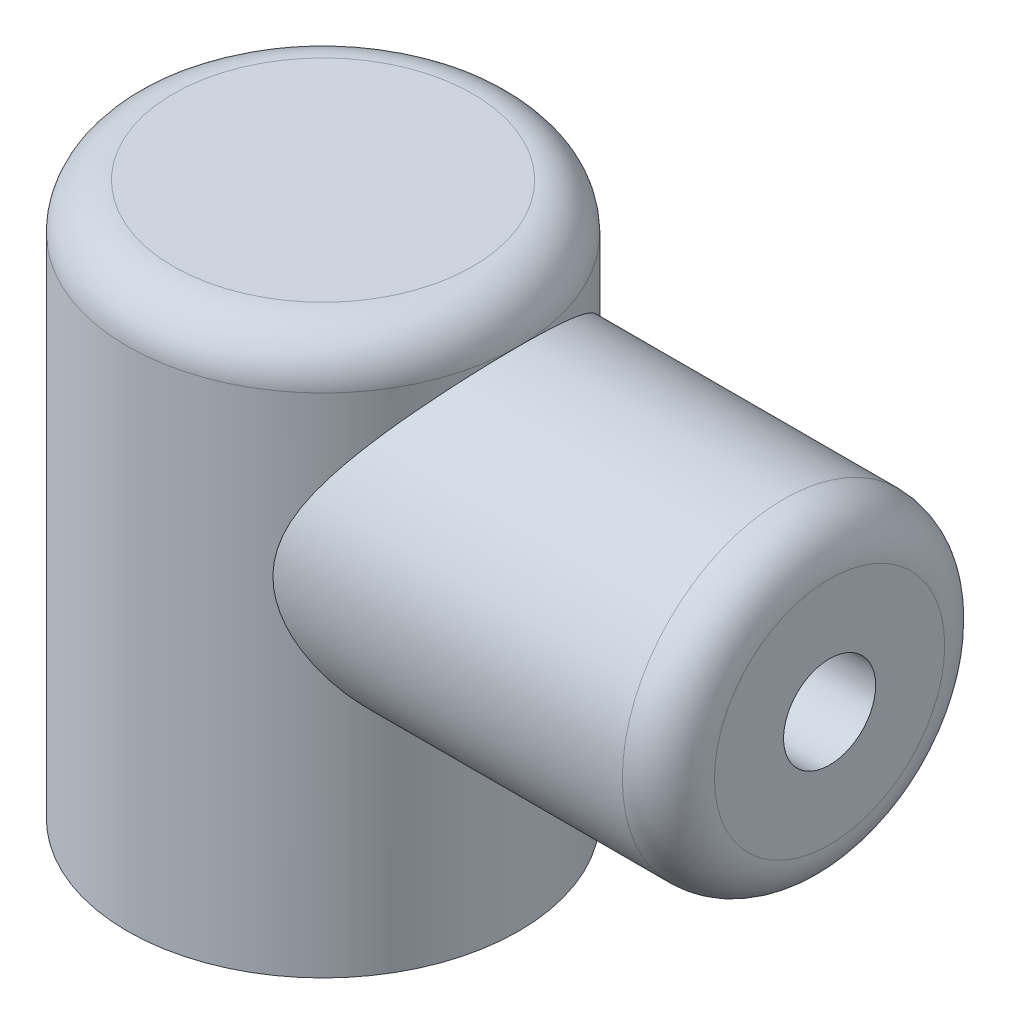
ISO-10303-21;
HEADER;
FILE_DESCRIPTION(('STEP AP214'),'2;1');
FILE_NAME('part.step','',(''),(''),'','','');
FILE_SCHEMA(('AUTOMOTIVE_DESIGN { 1 0 10303 214 1 1 1 1 }'));
ENDSEC;
DATA;
#1=APPLICATION_CONTEXT('core data for automotive mechanical design processes');
#2=APPLICATION_PROTOCOL_DEFINITION('international standard','automotive_design',2000,#1);
#3=PRODUCT_CONTEXT('',#1,'mechanical');
#4=PRODUCT('Part','Part','',(#3));
#5=PRODUCT_RELATED_PRODUCT_CATEGORY('part','',(#4));
#6=PRODUCT_DEFINITION_FORMATION('','',#4);
#7=PRODUCT_DEFINITION_CONTEXT('part definition',#1,'design');
#8=PRODUCT_DEFINITION('design','',#6,#7);
#9=PRODUCT_DEFINITION_SHAPE('','',#8);
#10=(LENGTH_UNIT() NAMED_UNIT(*) SI_UNIT(.MILLI.,.METRE.));
#11=(NAMED_UNIT(*) PLANE_ANGLE_UNIT() SI_UNIT($,.RADIAN.));
#12=(NAMED_UNIT(*) SI_UNIT($,.STERADIAN.) SOLID_ANGLE_UNIT());
#13=UNCERTAINTY_MEASURE_WITH_UNIT(LENGTH_MEASURE(1.E-05),#10,'distance_accuracy_value','');
#14=(GEOMETRIC_REPRESENTATION_CONTEXT(3) GLOBAL_UNCERTAINTY_ASSIGNED_CONTEXT((#13)) GLOBAL_UNIT_ASSIGNED_CONTEXT((#10,
#11,#12)) REPRESENTATION_CONTEXT('',''));
#15=CARTESIAN_POINT('',(0.,0.,0.));
#16=DIRECTION('',(0.,0.,1.));
#17=DIRECTION('',(1.,0.,0.));
#18=AXIS2_PLACEMENT_3D('',#15,#16,#17);
#19=CARTESIAN_POINT('',(0.,120.,0.));
#20=DIRECTION('',(0.,-1.,0.));
#21=DIRECTION('',(0.,0.,-1.));
#22=AXIS2_PLACEMENT_3D('',#19,#20,#21);
#23=CYLINDRICAL_SURFACE('',#22,42.5);
#24=CARTESIAN_POINT('',(0.,0.,0.));
#25=DIRECTION('',(0.,1.,0.));
#26=DIRECTION('',(0.,0.,1.));
#27=AXIS2_PLACEMENT_3D('',#24,#25,#26);
#28=CIRCLE('',#27,42.5);
#29=CARTESIAN_POINT('',(0.,0.,42.5));
#30=VERTEX_POINT('',#29);
#31=EDGE_CURVE('E75',#30,#30,#28,.T.);
#32=ORIENTED_EDGE('',*,*,#31,.T.);
#33=EDGE_LOOP('',(#32));
#34=FACE_BOUND('',#33,.T.);
#35=CARTESIAN_POINT('',(24.1091269024824,75.,35.));
#36=CARTESIAN_POINT('',(24.1091441163489,74.3695805554471,34.9999933033889));
#37=CARTESIAN_POINT('',(24.1339807896554,73.7389896330274,34.9829201330865));
#38=CARTESIAN_POINT('',(24.2320409000779,72.4831730395529,34.9150622819182));
#39=CARTESIAN_POINT('',(24.3052945978711,71.8579509717511,34.8642565180653));
#40=CARTESIAN_POINT('',(24.4967277254122,70.6162675829255,34.7300149179889));
#41=CARTESIAN_POINT('',(24.6150307906742,69.999835258718,34.6464892655435));
#42=CARTESIAN_POINT('',(24.8912020466167,68.7811144364059,34.4486112138779));
#43=CARTESIAN_POINT('',(25.0490705935653,68.1788260657144,34.3342585370747));
#44=CARTESIAN_POINT('',(25.4640931589299,66.767093372393,34.0282080527054));
#45=CARTESIAN_POINT('',(25.7362634759287,65.9648596080729,33.8235935171676));
#46=CARTESIAN_POINT('',(26.3290738615771,64.3933646844921,33.3642078147038));
#47=CARTESIAN_POINT('',(26.649737816113,63.6241200152503,33.109411911787));
#48=CARTESIAN_POINT('',(27.3270848190682,62.1169149523671,32.552621407464));
#49=CARTESIAN_POINT('',(27.6838577091993,61.3790394156592,32.2505080018764));
#50=CARTESIAN_POINT('',(28.4217651117175,59.9357568725332,31.6021277153579));
#51=CARTESIAN_POINT('',(28.8028986750918,59.2303486031348,31.255862553914));
#52=CARTESIAN_POINT('',(29.4675587242691,58.0515534667091,30.6277200083681));
#53=CARTESIAN_POINT('',(29.7472547292273,57.5703246689317,30.3563829941905));
#54=CARTESIAN_POINT('',(30.3118014178767,56.6233878205289,29.7926799637585));
#55=CARTESIAN_POINT('',(30.596652484685,56.1576809308398,29.5003123796981));
#56=CARTESIAN_POINT('',(31.1691856471983,55.241557934973,28.8947322720906));
#57=CARTESIAN_POINT('',(31.4568685910821,54.7911466015689,28.5815133307896));
#58=CARTESIAN_POINT('',(32.0328526611075,53.9057699221076,27.9344604761189));
#59=CARTESIAN_POINT('',(32.3211538419368,53.4708060077595,27.6006246597338));
#60=CARTESIAN_POINT('',(33.1834350411128,52.1901411859788,26.5690023825928));
#61=CARTESIAN_POINT('',(33.755464342043,51.3676070045341,25.8404000996342));
#62=CARTESIAN_POINT('',(34.879502584609,49.7881642111188,24.3018108099273));
#63=CARTESIAN_POINT('',(35.4315187730531,49.0312317036969,23.4918536708029));
#64=CARTESIAN_POINT('',(36.3910411335628,47.7382278759611,21.9676161326934));
#65=CARTESIAN_POINT('',(36.8047419369442,47.1889444051907,21.2684231386584));
#66=CARTESIAN_POINT('',(37.6046887429783,46.1386339586623,19.8197336210164));
#67=CARTESIAN_POINT('',(37.9909358657603,45.6376050137896,19.0702391521732));
#68=CARTESIAN_POINT('',(38.7287366943713,44.6890495290468,17.5233647077875));
#69=CARTESIAN_POINT('',(39.0803347747587,44.2414543976431,16.7260481404061));
#70=CARTESIAN_POINT('',(39.7425395451134,43.4043515489623,15.085183902923));
#71=CARTESIAN_POINT('',(40.0531534793446,43.0148335645149,14.2416444404813));
#72=CARTESIAN_POINT('',(40.5779874405307,42.3602313940538,12.6589666481398));
#73=CARTESIAN_POINT('',(40.7996220335838,42.0852467866725,11.9263711998335));
#74=CARTESIAN_POINT('',(41.2062283008463,41.5825627695573,10.4352144098018));
#75=CARTESIAN_POINT('',(41.391203808074,41.354858416153,9.67665579248249));
#76=CARTESIAN_POINT('',(41.7210157408059,40.9499346756677,8.13791582165729));
#77=CARTESIAN_POINT('',(41.86586776934,40.7726956631113,7.35774300357778));
#78=CARTESIAN_POINT('',(42.1126270597445,40.471303916865,5.78046106855623));
#79=CARTESIAN_POINT('',(42.2145338219223,40.347151800871,4.98335175466177));
#80=CARTESIAN_POINT('',(42.3735384783194,40.153625357556,3.37476014399933));
#81=CARTESIAN_POINT('',(42.4304544482362,40.0844734215185,2.56323292400519));
#82=CARTESIAN_POINT('',(42.4975130508196,40.0030122228911,0.935386300685297));
#83=CARTESIAN_POINT('',(42.5076555876615,39.990703076755,0.119066887545232));
#84=CARTESIAN_POINT('',(42.4809362227141,40.0231501661696,-1.51164080281081));
#85=CARTESIAN_POINT('',(42.4440751490446,40.0679053963479,-2.32602911379611));
#86=CARTESIAN_POINT('',(42.3241859576354,40.2136745767323,-3.94628377312993));
#87=CARTESIAN_POINT('',(42.2411592625876,40.3146867932599,-4.75215038331295));
#88=CARTESIAN_POINT('',(42.0374583698247,40.5630634196291,-6.29851445820613));
#89=CARTESIAN_POINT('',(41.9195072796505,40.7070799748745,-7.03991516587761));
#90=CARTESIAN_POINT('',(41.6468952197124,41.040860520042,-8.5053855168105));
#91=CARTESIAN_POINT('',(41.4922361415418,41.23062215269,-9.22945605099443));
#92=CARTESIAN_POINT('',(41.1488213673743,41.6534752146308,-10.6566097709098));
#93=CARTESIAN_POINT('',(40.9600606704953,41.8865729991636,-11.359689860822));
#94=CARTESIAN_POINT('',(40.5514237117821,42.3933989560956,-12.7417190982193));
#95=CARTESIAN_POINT('',(40.3315456126257,42.6671295276978,-13.4206668178486));
#96=CARTESIAN_POINT('',(39.8429850772002,43.2785527289007,-14.8113819440679));
#97=CARTESIAN_POINT('',(39.5716996663059,43.6197714069671,-15.5206828270397));
#98=CARTESIAN_POINT('',(39.0001563640812,44.3436542190332,-16.9055941709998));
#99=CARTESIAN_POINT('',(38.6998970687751,44.7263203615457,-17.5812029969775));
#100=CARTESIAN_POINT('',(38.0745191516996,45.5299687888279,-18.8974073668099));
#101=CARTESIAN_POINT('',(37.7493941542164,45.9509609059072,-19.53799385804));
#102=CARTESIAN_POINT('',(37.0784915178842,46.8283044417351,-20.7830617562839));
#103=CARTESIAN_POINT('',(36.7327128658368,47.2846575955036,-21.3875413891034));
#104=CARTESIAN_POINT('',(35.9510630614449,48.3284360161716,-22.6815959809241));
#105=CARTESIAN_POINT('',(35.511387238714,48.9234081533923,-23.3627966550403));
#106=CARTESIAN_POINT('',(34.6149812757496,50.1579551695389,-24.6714873410868));
#107=CARTESIAN_POINT('',(34.1582485522642,50.7975368173653,-25.2989691695803));
#108=CARTESIAN_POINT('',(33.2344387856638,52.1198304233704,-26.5008927440641));
#109=CARTESIAN_POINT('',(32.7673477912127,52.8026031748346,-27.0752567954144));
#110=CARTESIAN_POINT('',(31.8313786645481,54.2090791139573,-28.1696935653511));
#111=CARTESIAN_POINT('',(31.3625006771722,54.9327790475617,-28.6897705908808));
#112=CARTESIAN_POINT('',(30.4411061286621,56.4060525611078,-29.6653009371319));
#113=CARTESIAN_POINT('',(29.9884498109046,57.1548210153051,-30.1218372394161));
#114=CARTESIAN_POINT('',(29.0997407595218,58.6923714170278,-30.9812374405547));
#115=CARTESIAN_POINT('',(28.6636914723462,59.4811615918803,-31.3840902413788));
#116=CARTESIAN_POINT('',(27.8212819214794,61.0985695481815,-32.1332127703566));
#117=CARTESIAN_POINT('',(27.4148727165001,61.9271177496787,-32.4795769972687));
#118=CARTESIAN_POINT('',(26.6464876050765,63.6263961944204,-33.1128716569087));
#119=CARTESIAN_POINT('',(26.2844849999021,64.4971006483221,-33.3998378737553));
#120=CARTESIAN_POINT('',(25.7445721698184,65.9551475912818,-33.8162312800062));
#121=CARTESIAN_POINT('',(25.5476786130233,66.529994128178,-33.9649404187285));
#122=CARTESIAN_POINT('',(25.1851728254214,67.695906369798,-34.2346034575806));
#123=CARTESIAN_POINT('',(25.0195565007119,68.2869699402458,-34.355560990587));
#124=CARTESIAN_POINT('',(24.7257109661857,69.4822640170546,-34.5676452918854));
#125=CARTESIAN_POINT('',(24.5974004052514,70.0864627379659,-34.6588370233398));
#126=CARTESIAN_POINT('',(24.3830566419295,71.3062628694528,-34.8099676845401));
#127=CARTESIAN_POINT('',(24.2970222205602,71.921863950724,-34.8699075153999));
#128=CARTESIAN_POINT('',(24.1708242762511,73.1656855332413,-34.9575072897095));
#129=CARTESIAN_POINT('',(24.1310764462856,73.7939696074419,-34.9848747531072));
#130=CARTESIAN_POINT('',(24.1009788606688,75.0522716929145,-35.0056163215024));
#131=CARTESIAN_POINT('',(24.1106270125899,75.6822896296098,-34.9989918664071));
#132=CARTESIAN_POINT('',(24.1788208945623,76.9389275773781,-34.9519139228089));
#133=CARTESIAN_POINT('',(24.2374103556555,77.5655440449216,-34.9114301796205));
#134=CARTESIAN_POINT('',(24.4004776174839,78.8097321316398,-34.7976499588347));
#135=CARTESIAN_POINT('',(24.5049625164107,79.4273023364457,-34.7243484055988));
#136=CARTESIAN_POINT('',(24.7787000188258,80.7654536295011,-34.5296871646768));
#137=CARTESIAN_POINT('',(24.9564813786516,81.4833397822663,-34.4018468109058));
#138=CARTESIAN_POINT('',(25.3603432613096,82.8966060528211,-34.105212373137));
#139=CARTESIAN_POINT('',(25.5864365168466,83.5919801817769,-33.9364074912548));
#140=CARTESIAN_POINT('',(26.0776826426794,84.960141321715,-33.560398298354));
#141=CARTESIAN_POINT('',(26.3429382589091,85.6328630202011,-33.3530925963355));
#142=CARTESIAN_POINT('',(26.9031276295858,86.9534942026062,-32.9028993396459));
#143=CARTESIAN_POINT('',(27.1980632176493,87.6014021501237,-32.6600095861835));
#144=CARTESIAN_POINT('',(27.7414828569742,88.730505568017,-32.1987158271231));
#145=CARTESIAN_POINT('',(27.9855993288178,89.2165726243723,-31.9869886908371));
#146=CARTESIAN_POINT('',(28.4840946806354,90.174350149901,-31.5438987457715));
#147=CARTESIAN_POINT('',(28.7384747035184,90.6460590098837,-31.3125337470125));
#148=CARTESIAN_POINT('',(29.2549053792374,91.5755507181167,-30.8305903021718));
#149=CARTESIAN_POINT('',(29.5169592824851,92.0333274927409,-30.5800036394458));
#150=CARTESIAN_POINT('',(30.046278028044,92.9349329575586,-30.0600883878982));
#151=CARTESIAN_POINT('',(30.3135427010669,93.3787620996654,-29.7907604072193));
#152=CARTESIAN_POINT('',(31.120663519617,94.6906771606373,-28.9543508205841));
#153=CARTESIAN_POINT('',(31.6653116448631,95.5382446701609,-28.3593355375047));
#154=CARTESIAN_POINT('',(32.7526412519324,97.1779426085027,-27.0962984822016));
#155=CARTESIAN_POINT('',(33.2953230810556,97.9700833301383,-26.4282903241745));
#156=CARTESIAN_POINT('',(34.3829006560159,99.5203602795836,-24.9979555277008));
#157=CARTESIAN_POINT('',(34.9273622210808,100.276730815455,-24.2333790254022));
#158=CARTESIAN_POINT('',(35.9889816373986,101.724498266931,-22.6267551371842));
#159=CARTESIAN_POINT('',(36.5061348587855,102.41588418042,-21.7846946805565));
#160=CARTESIAN_POINT('',(37.2512410271021,103.398064112907,-20.4658133699474));
#161=CARTESIAN_POINT('',(37.4942540792765,103.715986440819,-20.0174140874554));
#162=CARTESIAN_POINT('',(37.9688331375198,104.332937169202,-19.1019221508278));
#163=CARTESIAN_POINT('',(38.2003998495445,104.631966735207,-18.6348306527628));
#164=CARTESIAN_POINT('',(38.6503934657029,105.209861723029,-17.6825972147274));
#165=CARTESIAN_POINT('',(38.8688275210651,105.488738136022,-17.1974653357027));
#166=CARTESIAN_POINT('',(39.2911658271326,106.025362362867,-16.2093519303902));
#167=CARTESIAN_POINT('',(39.4950666651489,106.283105216261,-15.7063662529405));
#168=CARTESIAN_POINT('',(39.961770855315,106.870614812976,-14.4872567515579));
#169=CARTESIAN_POINT('',(40.2172099898158,107.190140784834,-13.7633080306653));
#170=CARTESIAN_POINT('',(40.6929503627197,107.782576937913,-12.2856065680239));
#171=CARTESIAN_POINT('',(40.9132607764861,108.055499292981,-11.5318616732146));
#172=CARTESIAN_POINT('',(41.3147950049561,108.551205757138,-9.99827633863648));
#173=CARTESIAN_POINT('',(41.4960383253829,108.774014889574,-9.2184491471666));
#174=CARTESIAN_POINT('',(41.8160125289117,109.166384119767,-7.63688183296249));
#175=CARTESIAN_POINT('',(41.9547422135317,109.335942716367,-6.83514109316752));
#176=CARTESIAN_POINT('',(42.187361355377,109.619793762307,-5.21087176073392));
#177=CARTESIAN_POINT('',(42.2810023992382,109.733780081405,-4.38825371048778));
#178=CARTESIAN_POINT('',(42.4201707448668,109.903054510551,-2.7329307424936));
#179=CARTESIAN_POINT('',(42.4656981595955,109.95834275841,-1.90022584843212));
#180=CARTESIAN_POINT('',(42.5075576969748,110.009179784858,-0.231859798571524));
#181=CARTESIAN_POINT('',(42.5038960583348,110.004736139317,0.60380096888996));
#182=CARTESIAN_POINT('',(42.4474764902901,109.936208220153,2.27096895465849));
#183=CARTESIAN_POINT('',(42.3947211544893,109.872127097158,3.10247639005167));
#184=CARTESIAN_POINT('',(42.2477514791521,109.693296785335,4.68575327694705));
#185=CARTESIAN_POINT('',(42.1573431167778,109.583196269004,5.43841104448095));
#186=CARTESIAN_POINT('',(41.9380524744517,109.315537824192,6.92946833560324));
#187=CARTESIAN_POINT('',(41.8091727766414,109.157983080766,7.66786881258052));
#188=CARTESIAN_POINT('',(41.5152557823321,108.797593546155,9.12616600337175));
#189=CARTESIAN_POINT('',(41.3502168929955,108.594756760257,9.84606190048466));
#190=CARTESIAN_POINT('',(40.9867476909895,108.146353036506,11.2637524783362));
#191=CARTESIAN_POINT('',(40.7883154163228,107.900783587908,11.9615458575978));
#192=CARTESIAN_POINT('',(40.3482857025656,107.35370386355,13.3732882061727));
#193=CARTESIAN_POINT('',(40.1048118896067,107.049720066226,14.0856915882014));
#194=CARTESIAN_POINT('',(39.5876117835045,106.400121469394,15.4797884367949));
#195=CARTESIAN_POINT('',(39.3138850936957,106.054506124022,16.1614815005311));
#196=CARTESIAN_POINT('',(38.7399424761209,105.324643415158,17.4926416055811));
#197=CARTESIAN_POINT('',(38.439714099846,104.940377884757,18.1420932761085));
#198=CARTESIAN_POINT('',(37.8166848831181,104.136168949526,19.4073623014548));
#199=CARTESIAN_POINT('',(37.4938796121909,103.716218538425,20.0231730121267));
#200=CARTESIAN_POINT('',(36.9184804761093,102.960100030678,21.0600859288104));
#201=CARTESIAN_POINT('',(36.6702058416058,102.631573055538,21.4892048632024));
#202=CARTESIAN_POINT('',(36.1651752550817,101.957736699448,22.3286825857205));
#203=CARTESIAN_POINT('',(35.9084207462345,101.612430169511,22.7390445380097));
#204=CARTESIAN_POINT('',(35.1273353063363,100.552083951423,23.9423189358798));
#205=CARTESIAN_POINT('',(34.5923105148656,99.8127847145118,24.7071917857433));
#206=CARTESIAN_POINT('',(33.5050024348188,98.2730139488999,26.1627991096799));
#207=CARTESIAN_POINT('',(32.9526861900428,97.4724208001887,26.8533792843033));
#208=CARTESIAN_POINT('',(31.8447254119797,95.8138882330314,28.1583962770441));
#209=CARTESIAN_POINT('',(31.2890818197064,94.9559643900877,28.7728536476472));
#210=CARTESIAN_POINT('',(30.2883763604854,93.3428506991626,29.820977967668));
#211=CARTESIAN_POINT('',(29.841428487091,92.5970019783134,30.267271600765));
#212=CARTESIAN_POINT('',(28.9649937630786,91.0659642866541,31.1070284140741));
#213=CARTESIAN_POINT('',(28.5355092150414,90.280770158332,31.500484643197));
#214=CARTESIAN_POINT('',(27.7071842885278,88.6716144396135,32.2314494959254));
#215=CARTESIAN_POINT('',(27.3082785906982,87.8477419099065,32.5690792638946));
#216=CARTESIAN_POINT('',(26.5554801267719,86.1586010830552,33.1857342257335));
#217=CARTESIAN_POINT('',(26.201560288575,85.2933581179007,33.4647947325602));
#218=CARTESIAN_POINT('',(25.6688552554142,83.8278782052265,33.8737477477291));
#219=CARTESIAN_POINT('',(25.4718028359175,83.239338588151,34.0218698646593));
#220=CARTESIAN_POINT('',(25.1110530375758,82.0454678647285,34.2889981703046));
#221=CARTESIAN_POINT('',(24.9473564890271,81.4401363408222,34.408003634261));
#222=CARTESIAN_POINT('',(24.6599486703108,80.2168242323189,34.6145671266489));
#223=CARTESIAN_POINT('',(24.5361092004101,79.598891141023,34.7022260838274));
#224=CARTESIAN_POINT('',(24.3333050845834,78.3521876248991,34.8447389624851));
#225=CARTESIAN_POINT('',(24.2543103895072,77.7234247485492,34.8996148522165));
#226=CARTESIAN_POINT('',(24.1696634090026,76.7443416969682,34.9582401394468));
#227=CARTESIAN_POINT('',(24.147003011616,76.3961052237049,34.973884441717));
#228=CARTESIAN_POINT('',(24.1167284723043,75.6985968470358,34.994767276351));
#229=CARTESIAN_POINT('',(24.109117364024,75.3493247490761,35.0000037106914));
#230=CARTESIAN_POINT('',(24.1091269024824,75.,35.));
#231=B_SPLINE_CURVE_WITH_KNOTS('',3,(#35,#36,#37,#38,#39,#40,#41,#42,#43,#44,#45,#46,#47,#48,
#49,#50,#51,#52,#53,#54,#55,#56,#57,#58,#59,#60,#61,#62,#63,#64,#65,#66,#67,#68,#69,#70,#71,#72,
#73,#74,#75,#76,#77,#78,#79,#80,#81,#82,#83,#84,#85,#86,#87,#88,#89,#90,#91,#92,#93,#94,#95,#96,
#97,#98,#99,#100,#101,#102,#103,#104,#105,#106,#107,#108,#109,#110,#111,#112,#113,#114,#115,
#116,#117,#118,#119,#120,#121,#122,#123,#124,#125,#126,#127,#128,#129,#130,#131,#132,#133,#134,
#135,#136,#137,#138,#139,#140,#141,#142,#143,#144,#145,#146,#147,#148,#149,#150,#151,#152,#153,
#154,#155,#156,#157,#158,#159,#160,#161,#162,#163,#164,#165,#166,#167,#168,#169,#170,#171,#172,
#173,#174,#175,#176,#177,#178,#179,#180,#181,#182,#183,#184,#185,#186,#187,#188,#189,#190,#191,
#192,#193,#194,#195,#196,#197,#198,#199,#200,#201,#202,#203,#204,#205,#206,#207,#208,#209,#210,
#211,#212,#213,#214,#215,#216,#217,#218,#219,#220,#221,#222,#223,#224,#225,#226,#227,#228,#229,
#230),.UNSPECIFIED.,.T.,.F.,(4,2,2,2,2,2,2,2,2,2,2,2,2,2,2,2,2,2,2,2,2,2,2,2,2,2,2,2,2,2,2,2,2,
2,2,2,2,2,2,2,2,2,2,2,2,2,2,2,2,2,2,2,2,2,2,2,2,2,2,2,2,2,2,2,2,2,2,2,2,2,2,2,2,2,2,2,2,2,2,2,2,
2,2,2,2,2,2,2,2,2,2,2,2,2,2,2,2,4),(0.,1.89085414030973,3.78289118482324,5.68015868782858,
7.57744327542669,10.1877367181751,12.7993200925606,15.4175689397017,18.0357158504501,
19.8928392863497,21.7501013125493,23.6079376446416,25.4659457190926,29.1776626131309,
32.8880217793446,35.8274545247577,38.7667672703502,41.7022653765465,44.6372439137339,
47.0746825876748,49.5118662721162,51.9481008611837,54.3843637964435,56.8304282934239,
59.2764978016482,61.7225242150879,64.1684752531991,66.4592248034715,68.7498563351264,
71.0408240528957,73.3319270969686,75.8271861508665,78.3225661772779,80.8185881929656,
83.3147327557721,86.3289016791131,89.3435289617228,92.3624981746664,95.3812276907924,
98.339683272432,101.298749512118,104.252813646295,107.205092901723,109.080431996085,
110.955525455372,112.826498770432,114.697418135066,116.585013436053,118.472528778632,
120.361732498975,122.25122850663,124.499336872345,126.748038464278,129.002748162384,
131.257597241155,133.008044151541,134.758686525765,136.510081459056,138.261419587292,
141.767664273906,145.2732561093,148.885413267109,152.498180877894,154.300585077788,
156.102877974898,157.904180396575,159.705904415859,162.197945539541,164.689334690402,
167.179477024832,169.66968955124,172.173469089145,174.677242748658,177.180698854411,
179.684022710907,181.979498488506,184.274820231654,186.570243105664,188.865800892233,
191.299189473984,193.732609965303,196.167179640637,198.602228422062,200.385853022137,
202.169175619114,205.736748854735,209.31159412454,212.885472104401,215.815419404898,
218.745751781371,221.669639374547,224.591758981863,226.504526488477,228.417341601999,
230.323941215269,232.229261760295,233.276800895939,234.324551173647),.UNSPECIFIED.);
#232=CARTESIAN_POINT('',(42.5,110.,0.));
#233=VERTEX_POINT('',#232);
#234=EDGE_CURVE('E65',#233,#233,#231,.T.);
#235=ORIENTED_EDGE('',*,*,#234,.F.);
#236=CARTESIAN_POINT('',(0.,110.,0.));
#237=DIRECTION('',(0.,1.,0.));
#238=DIRECTION('',(0.,0.,1.));
#239=AXIS2_PLACEMENT_3D('',#236,#237,#238);
#240=CIRCLE('',#239,42.5);
#241=EDGE_CURVE('E52',#233,#233,#240,.F.);
#242=ORIENTED_EDGE('',*,*,#241,.T.);
#243=EDGE_LOOP('',(#235,#242));
#244=FACE_BOUND('',#243,.T.);
#245=ADVANCED_FACE('F40',(#34,#244),#23,.T.);
#246=CARTESIAN_POINT('',(0.,120.,0.));
#247=DIRECTION('',(0.,1.,0.));
#248=DIRECTION('',(0.,0.,1.));
#249=AXIS2_PLACEMENT_3D('',#246,#247,#248);
#250=PLANE('',#249);
#251=CARTESIAN_POINT('',(0.,120.,0.));
#252=DIRECTION('',(0.,1.,0.));
#253=DIRECTION('',(0.,0.,1.));
#254=AXIS2_PLACEMENT_3D('',#251,#252,#253);
#255=CIRCLE('',#254,32.5);
#256=CARTESIAN_POINT('',(0.,120.,32.5));
#257=VERTEX_POINT('',#256);
#258=EDGE_CURVE('E59',#257,#257,#255,.T.);
#259=ORIENTED_EDGE('',*,*,#258,.T.);
#260=EDGE_LOOP('',(#259));
#261=FACE_BOUND('',#260,.T.);
#262=ADVANCED_FACE('F88',(#261),#250,.T.);
#263=CARTESIAN_POINT('',(0.,0.,0.));
#264=DIRECTION('',(0.,1.,0.));
#265=DIRECTION('',(0.,0.,1.));
#266=AXIS2_PLACEMENT_3D('',#263,#264,#265);
#267=PLANE('',#266);
#268=ORIENTED_EDGE('',*,*,#31,.F.);
#269=EDGE_LOOP('',(#268));
#270=FACE_BOUND('',#269,.T.);
#271=ADVANCED_FACE('F85',(#270),#267,.F.);
#272=CARTESIAN_POINT('',(110.,75.,0.));
#273=DIRECTION('',(-1.,0.,0.));
#274=DIRECTION('',(0.,0.,1.));
#275=AXIS2_PLACEMENT_3D('',#272,#273,#274);
#276=CYLINDRICAL_SURFACE('',#275,35.);
#277=CARTESIAN_POINT('',(100.,75.,0.));
#278=DIRECTION('',(1.,0.,0.));
#279=DIRECTION('',(0.,0.,-1.));
#280=AXIS2_PLACEMENT_3D('',#277,#278,#279);
#281=CIRCLE('',#280,35.);
#282=CARTESIAN_POINT('',(100.,75.,-35.));
#283=VERTEX_POINT('',#282);
#284=EDGE_CURVE('E11',#283,#283,#281,.F.);
#285=ORIENTED_EDGE('',*,*,#284,.T.);
#286=EDGE_LOOP('',(#285));
#287=FACE_BOUND('',#286,.T.);
#288=ORIENTED_EDGE('',*,*,#234,.T.);
#289=EDGE_LOOP('',(#288));
#290=FACE_BOUND('',#289,.T.);
#291=ADVANCED_FACE('F79',(#287,#290),#276,.T.);
#292=CARTESIAN_POINT('',(110.,75.,0.));
#293=DIRECTION('',(1.,0.,0.));
#294=DIRECTION('',(0.,0.,-1.));
#295=AXIS2_PLACEMENT_3D('',#292,#293,#294);
#296=PLANE('',#295);
#297=CARTESIAN_POINT('',(110.,75.,0.));
#298=DIRECTION('',(1.,0.,0.));
#299=DIRECTION('',(0.,0.,-1.));
#300=AXIS2_PLACEMENT_3D('',#297,#298,#299);
#301=CIRCLE('',#300,25.);
#302=CARTESIAN_POINT('',(110.,75.,-25.));
#303=VERTEX_POINT('',#302);
#304=EDGE_CURVE('E48',#303,#303,#301,.T.);
#305=ORIENTED_EDGE('',*,*,#304,.T.);
#306=EDGE_LOOP('',(#305));
#307=FACE_BOUND('',#306,.T.);
#308=CARTESIAN_POINT('',(110.,75.,0.));
#309=DIRECTION('',(1.,0.,0.));
#310=DIRECTION('',(0.,0.,-1.));
#311=AXIS2_PLACEMENT_3D('',#308,#309,#310);
#312=CIRCLE('',#311,10.);
#313=CARTESIAN_POINT('',(110.,75.,-10.));
#314=VERTEX_POINT('',#313);
#315=EDGE_CURVE('E107',#314,#314,#312,.T.);
#316=ORIENTED_EDGE('',*,*,#315,.F.);
#317=EDGE_LOOP('',(#316));
#318=FACE_BOUND('',#317,.T.);
#319=ADVANCED_FACE('F84',(#307,#318),#296,.T.);
#320=CARTESIAN_POINT('',(0.,110.,0.));
#321=DIRECTION('',(0.,1.,0.));
#322=DIRECTION('',(0.,0.,1.));
#323=AXIS2_PLACEMENT_3D('',#320,#321,#322);
#324=TOROIDAL_SURFACE('',#323,32.5,10.);
#325=ORIENTED_EDGE('',*,*,#241,.F.);
#326=EDGE_LOOP('',(#325));
#327=FACE_BOUND('',#326,.T.);
#328=ORIENTED_EDGE('',*,*,#258,.F.);
#329=EDGE_LOOP('',(#328));
#330=FACE_BOUND('',#329,.T.);
#331=ADVANCED_FACE('F53',(#327,#330),#324,.T.);
#332=CARTESIAN_POINT('',(70.,75.,0.));
#333=DIRECTION('',(1.,0.,0.));
#334=DIRECTION('',(0.,0.,-1.));
#335=AXIS2_PLACEMENT_3D('',#332,#333,#334);
#336=CYLINDRICAL_SURFACE('',#335,10.);
#337=CARTESIAN_POINT('',(70.,75.,0.));
#338=DIRECTION('',(1.,0.,0.));
#339=DIRECTION('',(0.,0.,-1.));
#340=AXIS2_PLACEMENT_3D('',#337,#338,#339);
#341=CIRCLE('',#340,10.);
#342=CARTESIAN_POINT('',(70.,75.,-10.));
#343=VERTEX_POINT('',#342);
#344=EDGE_CURVE('E104',#343,#343,#341,.T.);
#345=ORIENTED_EDGE('',*,*,#344,.F.);
#346=EDGE_LOOP('',(#345));
#347=FACE_BOUND('',#346,.T.);
#348=ORIENTED_EDGE('',*,*,#315,.T.);
#349=EDGE_LOOP('',(#348));
#350=FACE_BOUND('',#349,.T.);
#351=ADVANCED_FACE('F115',(#347,#350),#336,.F.);
#352=CARTESIAN_POINT('',(70.,75.,0.));
#353=DIRECTION('',(1.,0.,0.));
#354=DIRECTION('',(0.,0.,-1.));
#355=AXIS2_PLACEMENT_3D('',#352,#353,#354);
#356=PLANE('',#355);
#357=ORIENTED_EDGE('',*,*,#344,.T.);
#358=EDGE_LOOP('',(#357));
#359=FACE_BOUND('',#358,.T.);
#360=ADVANCED_FACE('F126',(#359),#356,.T.);
#361=CARTESIAN_POINT('',(100.,75.,0.));
#362=DIRECTION('',(1.,0.,0.));
#363=DIRECTION('',(0.,0.,-1.));
#364=AXIS2_PLACEMENT_3D('',#361,#362,#363);
#365=TOROIDAL_SURFACE('',#364,25.,10.);
#366=ORIENTED_EDGE('',*,*,#284,.F.);
#367=EDGE_LOOP('',(#366));
#368=FACE_BOUND('',#367,.T.);
#369=ORIENTED_EDGE('',*,*,#304,.F.);
#370=EDGE_LOOP('',(#369));
#371=FACE_BOUND('',#370,.T.);
#372=ADVANCED_FACE('F42',(#368,#371),#365,.T.);
#373=CLOSED_SHELL('',(#245,#262,#271,#291,#319,#331,#351,#360,#372));
#374=MANIFOLD_SOLID_BREP('B2',#373);
#375=ADVANCED_BREP_SHAPE_REPRESENTATION('',(#18,#374),#14);
#376=SHAPE_DEFINITION_REPRESENTATION(#9,#375);
ENDSEC;
END-ISO-10303-21;
